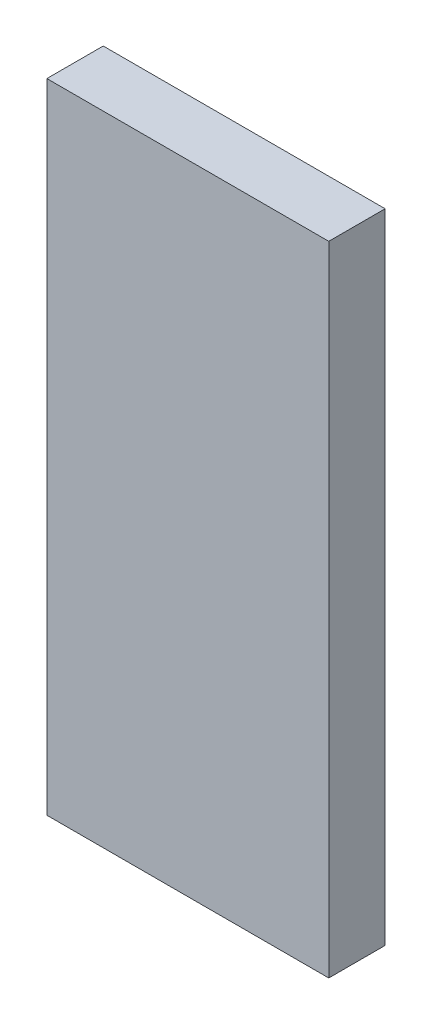
ISO-10303-21;
HEADER;
FILE_DESCRIPTION(('STEP AP214'),'2;1');
FILE_NAME('part.step','',(''),(''),'','','');
FILE_SCHEMA(('AUTOMOTIVE_DESIGN { 1 0 10303 214 1 1 1 1 }'));
ENDSEC;
DATA;
#1=APPLICATION_CONTEXT('core data for automotive mechanical design processes');
#2=APPLICATION_PROTOCOL_DEFINITION('international standard','automotive_design',2000,#1);
#3=PRODUCT_CONTEXT('',#1,'mechanical');
#4=PRODUCT('Part','Part','',(#3));
#5=PRODUCT_RELATED_PRODUCT_CATEGORY('part','',(#4));
#6=PRODUCT_DEFINITION_FORMATION('','',#4);
#7=PRODUCT_DEFINITION_CONTEXT('part definition',#1,'design');
#8=PRODUCT_DEFINITION('design','',#6,#7);
#9=PRODUCT_DEFINITION_SHAPE('','',#8);
#10=(LENGTH_UNIT() NAMED_UNIT(*) SI_UNIT(.MILLI.,.METRE.));
#11=(NAMED_UNIT(*) PLANE_ANGLE_UNIT() SI_UNIT($,.RADIAN.));
#12=(NAMED_UNIT(*) SI_UNIT($,.STERADIAN.) SOLID_ANGLE_UNIT());
#13=UNCERTAINTY_MEASURE_WITH_UNIT(LENGTH_MEASURE(1.E-05),#10,'distance_accuracy_value','');
#14=(GEOMETRIC_REPRESENTATION_CONTEXT(3) GLOBAL_UNCERTAINTY_ASSIGNED_CONTEXT((#13)) GLOBAL_UNIT_ASSIGNED_CONTEXT((#10,
#11,#12)) REPRESENTATION_CONTEXT('',''));
#15=CARTESIAN_POINT('',(0.,0.,0.));
#16=DIRECTION('',(0.,0.,1.));
#17=DIRECTION('',(1.,0.,0.));
#18=AXIS2_PLACEMENT_3D('',#15,#16,#17);
#19=CARTESIAN_POINT('',(-10.,500000.,83.1415953434962));
#20=DIRECTION('',(0.,0.,1.));
#21=DIRECTION('',(1.,0.,0.));
#22=AXIS2_PLACEMENT_3D('',#19,#20,#21);
#23=PLANE('',#22);
#24=DIRECTION('',(0.,-1.,0.));
#25=VECTOR('',#24,1.);
#26=CARTESIAN_POINT('',(-10.,500000.,83.1415953434962));
#27=LINE('',#26,#25);
#28=CARTESIAN_POINT('',(-10.,49.3657024782124,83.1415953434962));
#29=VERTEX_POINT('',#28);
#30=CARTESIAN_POINT('',(-10.,4.099999999994,83.1415953434962));
#31=VERTEX_POINT('',#30);
#32=EDGE_CURVE('E49',#29,#31,#27,.T.);
#33=ORIENTED_EDGE('',*,*,#32,.F.);
#34=DIRECTION('',(1.,0.,0.));
#35=VECTOR('',#34,1.);
#36=CARTESIAN_POINT('',(-10.,49.3657024782124,83.1415953434962));
#37=LINE('',#36,#35);
#38=CARTESIAN_POINT('',(10.,49.3657024782124,83.1415953434913));
#39=VERTEX_POINT('',#38);
#40=EDGE_CURVE('E78',#29,#39,#37,.T.);
#41=ORIENTED_EDGE('',*,*,#40,.T.);
#42=DIRECTION('',(0.,-1.,0.));
#43=VECTOR('',#42,1.);
#44=CARTESIAN_POINT('',(10.,500000.,83.1415953434962));
#45=LINE('',#44,#43);
#46=CARTESIAN_POINT('',(10.,4.099999999994,83.1415953434962));
#47=VERTEX_POINT('',#46);
#48=EDGE_CURVE('E99',#39,#47,#45,.T.);
#49=ORIENTED_EDGE('',*,*,#48,.T.);
#50=DIRECTION('',(1.,0.,0.));
#51=VECTOR('',#50,1.);
#52=CARTESIAN_POINT('',(-10.,4.099999999994,83.1415953434962));
#53=LINE('',#52,#51);
#54=EDGE_CURVE('E91',#31,#47,#53,.T.);
#55=ORIENTED_EDGE('',*,*,#54,.F.);
#56=EDGE_LOOP('',(#33,#41,#49,#55));
#57=FACE_BOUND('',#56,.T.);
#58=ADVANCED_FACE('F35',(#57),#23,.F.);
#59=CARTESIAN_POINT('',(-10.,500000.,87.1415953434962));
#60=DIRECTION('',(0.,0.,-1.));
#61=DIRECTION('',(-1.,0.,0.));
#62=AXIS2_PLACEMENT_3D('',#59,#60,#61);
#63=PLANE('',#62);
#64=DIRECTION('',(-1.,0.,0.));
#65=VECTOR('',#64,1.);
#66=CARTESIAN_POINT('',(-10.,4.099999999994,87.1415953434962));
#67=LINE('',#66,#65);
#68=CARTESIAN_POINT('',(10.,4.099999999994,87.1415953434962));
#69=VERTEX_POINT('',#68);
#70=CARTESIAN_POINT('',(-10.,4.099999999994,87.1415953434962));
#71=VERTEX_POINT('',#70);
#72=EDGE_CURVE('E56',#69,#71,#67,.T.);
#73=ORIENTED_EDGE('',*,*,#72,.F.);
#74=DIRECTION('',(0.,-1.,0.));
#75=VECTOR('',#74,1.);
#76=CARTESIAN_POINT('',(10.,500000.,87.1415953434962));
#77=LINE('',#76,#75);
#78=CARTESIAN_POINT('',(10.,49.3657024782124,87.1415953434962));
#79=VERTEX_POINT('',#78);
#80=EDGE_CURVE('E87',#79,#69,#77,.T.);
#81=ORIENTED_EDGE('',*,*,#80,.F.);
#82=DIRECTION('',(1.,0.,0.));
#83=VECTOR('',#82,1.);
#84=CARTESIAN_POINT('',(-10.,49.3657024782124,87.1415953434962));
#85=LINE('',#84,#83);
#86=CARTESIAN_POINT('',(-10.,49.3657024782124,87.1415953434962));
#87=VERTEX_POINT('',#86);
#88=EDGE_CURVE('E42',#87,#79,#85,.T.);
#89=ORIENTED_EDGE('',*,*,#88,.F.);
#90=DIRECTION('',(0.,-1.,0.));
#91=VECTOR('',#90,1.);
#92=CARTESIAN_POINT('',(-10.,500000.,87.1415953434962));
#93=LINE('',#92,#91);
#94=EDGE_CURVE('E85',#87,#71,#93,.T.);
#95=ORIENTED_EDGE('',*,*,#94,.T.);
#96=EDGE_LOOP('',(#73,#81,#89,#95));
#97=FACE_BOUND('',#96,.T.);
#98=ADVANCED_FACE('F84',(#97),#63,.F.);
#99=CARTESIAN_POINT('',(-10.,500000.,83.1415953434962));
#100=DIRECTION('',(1.,0.,0.));
#101=DIRECTION('',(0.,0.,-1.));
#102=AXIS2_PLACEMENT_3D('',#99,#100,#101);
#103=PLANE('',#102);
#104=ORIENTED_EDGE('',*,*,#94,.F.);
#105=DIRECTION('',(0.,0.,1.));
#106=VECTOR('',#105,1.);
#107=CARTESIAN_POINT('',(-10.,49.3657024782124,77.1415953434962));
#108=LINE('',#107,#106);
#109=EDGE_CURVE('E74',#29,#87,#108,.T.);
#110=ORIENTED_EDGE('',*,*,#109,.F.);
#111=ORIENTED_EDGE('',*,*,#32,.T.);
#112=DIRECTION('',(0.,0.,-1.));
#113=VECTOR('',#112,1.);
#114=CARTESIAN_POINT('',(-10.,4.099999999994,83.1415953434962));
#115=LINE('',#114,#113);
#116=EDGE_CURVE('E90',#71,#31,#115,.T.);
#117=ORIENTED_EDGE('',*,*,#116,.F.);
#118=EDGE_LOOP('',(#104,#110,#111,#117));
#119=FACE_BOUND('',#118,.T.);
#120=ADVANCED_FACE('F89',(#119),#103,.F.);
#121=CARTESIAN_POINT('',(-99.9943656155855,4.1,159.759404921541));
#122=DIRECTION('',(0.,-1.,0.));
#123=DIRECTION('',(0.,0.,-1.));
#124=AXIS2_PLACEMENT_3D('',#121,#122,#123);
#125=PLANE('',#124);
#126=ORIENTED_EDGE('',*,*,#54,.T.);
#127=DIRECTION('',(0.,0.,-1.));
#128=VECTOR('',#127,1.);
#129=CARTESIAN_POINT('',(10.,4.099999999994,83.1415953434962));
#130=LINE('',#129,#128);
#131=EDGE_CURVE('E101',#69,#47,#130,.T.);
#132=ORIENTED_EDGE('',*,*,#131,.F.);
#133=ORIENTED_EDGE('',*,*,#72,.T.);
#134=ORIENTED_EDGE('',*,*,#116,.T.);
#135=EDGE_LOOP('',(#126,#132,#133,#134));
#136=FACE_BOUND('',#135,.T.);
#137=ADVANCED_FACE('F109',(#136),#125,.T.);
#138=CARTESIAN_POINT('',(10.,500000.,83.1415953434962));
#139=DIRECTION('',(-1.,0.,0.));
#140=DIRECTION('',(0.,0.,-1.));
#141=AXIS2_PLACEMENT_3D('',#138,#139,#140);
#142=PLANE('',#141);
#143=ORIENTED_EDGE('',*,*,#48,.F.);
#144=DIRECTION('',(0.,0.,1.));
#145=VECTOR('',#144,1.);
#146=CARTESIAN_POINT('',(10.,49.3657024782124,83.1415953434962));
#147=LINE('',#146,#145);
#148=EDGE_CURVE('E11',#39,#79,#147,.T.);
#149=ORIENTED_EDGE('',*,*,#148,.T.);
#150=ORIENTED_EDGE('',*,*,#80,.T.);
#151=ORIENTED_EDGE('',*,*,#131,.T.);
#152=EDGE_LOOP('',(#143,#149,#150,#151));
#153=FACE_BOUND('',#152,.T.);
#154=ADVANCED_FACE('F108',(#153),#142,.F.);
#155=CARTESIAN_POINT('',(-10.,49.3657024782124,77.1415953434962));
#156=DIRECTION('',(0.,-1.,0.));
#157=DIRECTION('',(0.,0.,-1.));
#158=AXIS2_PLACEMENT_3D('',#155,#156,#157);
#159=PLANE('',#158);
#160=ORIENTED_EDGE('',*,*,#109,.T.);
#161=ORIENTED_EDGE('',*,*,#88,.T.);
#162=ORIENTED_EDGE('',*,*,#148,.F.);
#163=ORIENTED_EDGE('',*,*,#40,.F.);
#164=EDGE_LOOP('',(#160,#161,#162,#163));
#165=FACE_BOUND('',#164,.T.);
#166=ADVANCED_FACE('F76',(#165),#159,.F.);
#167=CLOSED_SHELL('',(#58,#98,#120,#137,#154,#166));
#168=MANIFOLD_SOLID_BREP('B2',#167);
#169=ADVANCED_BREP_SHAPE_REPRESENTATION('',(#18,#168),#14);
#170=SHAPE_DEFINITION_REPRESENTATION(#9,#169);
ENDSEC;
END-ISO-10303-21;
